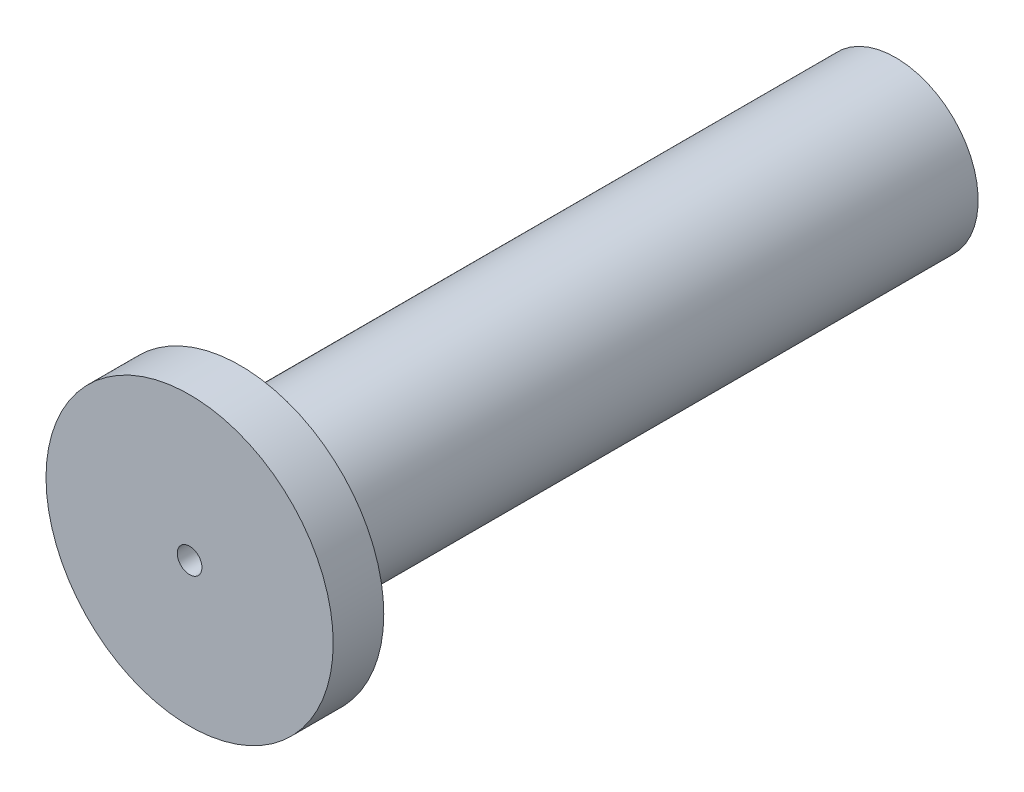
ISO-10303-21;
HEADER;
FILE_DESCRIPTION(('STEP AP214'),'2;1');
FILE_NAME('part.step','',(''),(''),'','','');
FILE_SCHEMA(('AUTOMOTIVE_DESIGN { 1 0 10303 214 1 1 1 1 }'));
ENDSEC;
DATA;
#1=APPLICATION_CONTEXT('core data for automotive mechanical design processes');
#2=APPLICATION_PROTOCOL_DEFINITION('international standard','automotive_design',2000,#1);
#3=PRODUCT_CONTEXT('',#1,'mechanical');
#4=PRODUCT('Part','Part','',(#3));
#5=PRODUCT_RELATED_PRODUCT_CATEGORY('part','',(#4));
#6=PRODUCT_DEFINITION_FORMATION('','',#4);
#7=PRODUCT_DEFINITION_CONTEXT('part definition',#1,'design');
#8=PRODUCT_DEFINITION('design','',#6,#7);
#9=PRODUCT_DEFINITION_SHAPE('','',#8);
#10=(LENGTH_UNIT() NAMED_UNIT(*) SI_UNIT(.MILLI.,.METRE.));
#11=(NAMED_UNIT(*) PLANE_ANGLE_UNIT() SI_UNIT($,.RADIAN.));
#12=(NAMED_UNIT(*) SI_UNIT($,.STERADIAN.) SOLID_ANGLE_UNIT());
#13=UNCERTAINTY_MEASURE_WITH_UNIT(LENGTH_MEASURE(1.E-05),#10,'distance_accuracy_value','');
#14=(GEOMETRIC_REPRESENTATION_CONTEXT(3) GLOBAL_UNCERTAINTY_ASSIGNED_CONTEXT((#13)) GLOBAL_UNIT_ASSIGNED_CONTEXT((#10,
#11,#12)) REPRESENTATION_CONTEXT('',''));
#15=CARTESIAN_POINT('',(0.,0.,0.));
#16=DIRECTION('',(0.,0.,1.));
#17=DIRECTION('',(1.,0.,0.));
#18=AXIS2_PLACEMENT_3D('',#15,#16,#17);
#19=CARTESIAN_POINT('',(0.,0.,0.));
#20=DIRECTION('',(0.,0.,-1.));
#21=DIRECTION('',(-1.,0.,0.));
#22=AXIS2_PLACEMENT_3D('',#19,#20,#21);
#23=PLANE('',#22);
#24=CARTESIAN_POINT('',(0.,0.,0.));
#25=DIRECTION('',(0.,0.,1.));
#26=DIRECTION('',(1.,0.,0.));
#27=AXIS2_PLACEMENT_3D('',#24,#25,#26);
#28=CIRCLE('',#27,1.975);
#29=CARTESIAN_POINT('',(1.975,0.,0.));
#30=VERTEX_POINT('',#29);
#31=EDGE_CURVE('E58',#30,#30,#28,.T.);
#32=ORIENTED_EDGE('',*,*,#31,.F.);
#33=EDGE_LOOP('',(#32));
#34=FACE_BOUND('',#33,.T.);
#35=CARTESIAN_POINT('',(0.,0.,0.));
#36=DIRECTION('',(0.,0.,-1.));
#37=DIRECTION('',(-1.,0.,0.));
#38=AXIS2_PLACEMENT_3D('',#35,#36,#37);
#39=CIRCLE('',#38,23.);
#40=CARTESIAN_POINT('',(-23.,0.,0.));
#41=VERTEX_POINT('',#40);
#42=EDGE_CURVE('E10',#41,#41,#39,.T.);
#43=ORIENTED_EDGE('',*,*,#42,.F.);
#44=EDGE_LOOP('',(#43));
#45=FACE_BOUND('',#44,.T.);
#46=ADVANCED_FACE('F30',(#34,#45),#23,.F.);
#47=CARTESIAN_POINT('',(0.,0.,-8.1));
#48=DIRECTION('',(0.,0.,-1.));
#49=DIRECTION('',(-1.,0.,0.));
#50=AXIS2_PLACEMENT_3D('',#47,#48,#49);
#51=CYLINDRICAL_SURFACE('',#50,23.);
#52=CARTESIAN_POINT('',(0.,0.,-8.1));
#53=DIRECTION('',(0.,0.,-1.));
#54=DIRECTION('',(-1.,0.,0.));
#55=AXIS2_PLACEMENT_3D('',#52,#53,#54);
#56=CIRCLE('',#55,23.);
#57=CARTESIAN_POINT('',(-23.,0.,-8.1));
#58=VERTEX_POINT('',#57);
#59=EDGE_CURVE('E36',#58,#58,#56,.T.);
#60=ORIENTED_EDGE('',*,*,#59,.F.);
#61=EDGE_LOOP('',(#60));
#62=FACE_BOUND('',#61,.T.);
#63=ORIENTED_EDGE('',*,*,#42,.T.);
#64=EDGE_LOOP('',(#63));
#65=FACE_BOUND('',#64,.T.);
#66=ADVANCED_FACE('F67',(#62,#65),#51,.T.);
#67=CARTESIAN_POINT('',(23.,0.,-8.1));
#68=DIRECTION('',(0.,0.,1.));
#69=DIRECTION('',(1.,0.,0.));
#70=AXIS2_PLACEMENT_3D('',#67,#68,#69);
#71=PLANE('',#70);
#72=CARTESIAN_POINT('',(0.,0.,-8.1));
#73=DIRECTION('',(0.,0.,-1.));
#74=DIRECTION('',(-1.,0.,0.));
#75=AXIS2_PLACEMENT_3D('',#72,#73,#74);
#76=CIRCLE('',#75,13.2);
#77=CARTESIAN_POINT('',(-13.2,0.,-8.1));
#78=VERTEX_POINT('',#77);
#79=EDGE_CURVE('E40',#78,#78,#76,.T.);
#80=ORIENTED_EDGE('',*,*,#79,.F.);
#81=EDGE_LOOP('',(#80));
#82=FACE_BOUND('',#81,.T.);
#83=ORIENTED_EDGE('',*,*,#59,.T.);
#84=EDGE_LOOP('',(#83));
#85=FACE_BOUND('',#84,.T.);
#86=ADVANCED_FACE('F71',(#82,#85),#71,.F.);
#87=CARTESIAN_POINT('',(0.,0.,-8.1));
#88=DIRECTION('',(0.,0.,-1.));
#89=DIRECTION('',(-1.,0.,0.));
#90=AXIS2_PLACEMENT_3D('',#87,#88,#89);
#91=CYLINDRICAL_SURFACE('',#90,13.2);
#92=CARTESIAN_POINT('',(0.,0.,-113.1));
#93=DIRECTION('',(0.,0.,-1.));
#94=DIRECTION('',(-1.,0.,0.));
#95=AXIS2_PLACEMENT_3D('',#92,#93,#94);
#96=CIRCLE('',#95,13.2);
#97=CARTESIAN_POINT('',(-13.2,0.,-113.1));
#98=VERTEX_POINT('',#97);
#99=EDGE_CURVE('E44',#98,#98,#96,.T.);
#100=ORIENTED_EDGE('',*,*,#99,.F.);
#101=EDGE_LOOP('',(#100));
#102=FACE_BOUND('',#101,.T.);
#103=ORIENTED_EDGE('',*,*,#79,.T.);
#104=EDGE_LOOP('',(#103));
#105=FACE_BOUND('',#104,.T.);
#106=ADVANCED_FACE('F76',(#102,#105),#91,.T.);
#107=CARTESIAN_POINT('',(13.2,0.,-113.1));
#108=DIRECTION('',(0.,0.,1.));
#109=DIRECTION('',(1.,0.,0.));
#110=AXIS2_PLACEMENT_3D('',#107,#108,#109);
#111=PLANE('',#110);
#112=CARTESIAN_POINT('',(0.,0.,-113.1));
#113=DIRECTION('',(0.,0.,-1.));
#114=DIRECTION('',(-1.,0.,0.));
#115=AXIS2_PLACEMENT_3D('',#112,#113,#114);
#116=CIRCLE('',#115,10.2);
#117=CARTESIAN_POINT('',(-10.2,0.,-113.1));
#118=VERTEX_POINT('',#117);
#119=EDGE_CURVE('E49',#118,#118,#116,.T.);
#120=ORIENTED_EDGE('',*,*,#119,.F.);
#121=EDGE_LOOP('',(#120));
#122=FACE_BOUND('',#121,.T.);
#123=ORIENTED_EDGE('',*,*,#99,.T.);
#124=EDGE_LOOP('',(#123));
#125=FACE_BOUND('',#124,.T.);
#126=ADVANCED_FACE('F82',(#122,#125),#111,.F.);
#127=CARTESIAN_POINT('',(0.,0.,-8.1));
#128=DIRECTION('',(0.,0.,-1.));
#129=DIRECTION('',(-1.,0.,0.));
#130=AXIS2_PLACEMENT_3D('',#127,#128,#129);
#131=CYLINDRICAL_SURFACE('',#130,10.2);
#132=CARTESIAN_POINT('',(0.,0.,-8.1));
#133=DIRECTION('',(0.,0.,-1.));
#134=DIRECTION('',(-1.,0.,0.));
#135=AXIS2_PLACEMENT_3D('',#132,#133,#134);
#136=CIRCLE('',#135,10.2);
#137=CARTESIAN_POINT('',(-10.2,0.,-8.1));
#138=VERTEX_POINT('',#137);
#139=EDGE_CURVE('E52',#138,#138,#136,.T.);
#140=ORIENTED_EDGE('',*,*,#139,.F.);
#141=EDGE_LOOP('',(#140));
#142=FACE_BOUND('',#141,.T.);
#143=ORIENTED_EDGE('',*,*,#119,.T.);
#144=EDGE_LOOP('',(#143));
#145=FACE_BOUND('',#144,.T.);
#146=ADVANCED_FACE('F86',(#142,#145),#131,.F.);
#147=CARTESIAN_POINT('',(10.2,0.,-8.1));
#148=DIRECTION('',(0.,0.,1.));
#149=DIRECTION('',(1.,0.,0.));
#150=AXIS2_PLACEMENT_3D('',#147,#148,#149);
#151=PLANE('',#150);
#152=CARTESIAN_POINT('',(0.,0.,-8.1));
#153=DIRECTION('',(0.,0.,1.));
#154=DIRECTION('',(1.,0.,0.));
#155=AXIS2_PLACEMENT_3D('',#152,#153,#154);
#156=CIRCLE('',#155,1.975);
#157=CARTESIAN_POINT('',(1.975,0.,-8.1));
#158=VERTEX_POINT('',#157);
#159=EDGE_CURVE('E55',#158,#158,#156,.F.);
#160=ORIENTED_EDGE('',*,*,#159,.F.);
#161=EDGE_LOOP('',(#160));
#162=FACE_BOUND('',#161,.T.);
#163=ORIENTED_EDGE('',*,*,#139,.T.);
#164=EDGE_LOOP('',(#163));
#165=FACE_BOUND('',#164,.T.);
#166=ADVANCED_FACE('F90',(#162,#165),#151,.F.);
#167=CARTESIAN_POINT('',(0.,0.,-113.101));
#168=DIRECTION('',(0.,0.,1.));
#169=DIRECTION('',(1.,0.,0.));
#170=AXIS2_PLACEMENT_3D('',#167,#168,#169);
#171=CYLINDRICAL_SURFACE('',#170,1.975);
#172=ORIENTED_EDGE('',*,*,#31,.T.);
#173=EDGE_LOOP('',(#172));
#174=FACE_BOUND('',#173,.T.);
#175=ORIENTED_EDGE('',*,*,#159,.T.);
#176=EDGE_LOOP('',(#175));
#177=FACE_BOUND('',#176,.T.);
#178=ADVANCED_FACE('F62',(#174,#177),#171,.F.);
#179=CLOSED_SHELL('',(#46,#66,#86,#106,#126,#146,#166,#178));
#180=MANIFOLD_SOLID_BREP('B2',#179);
#181=ADVANCED_BREP_SHAPE_REPRESENTATION('',(#18,#180),#14);
#182=SHAPE_DEFINITION_REPRESENTATION(#9,#181);
ENDSEC;
END-ISO-10303-21;
